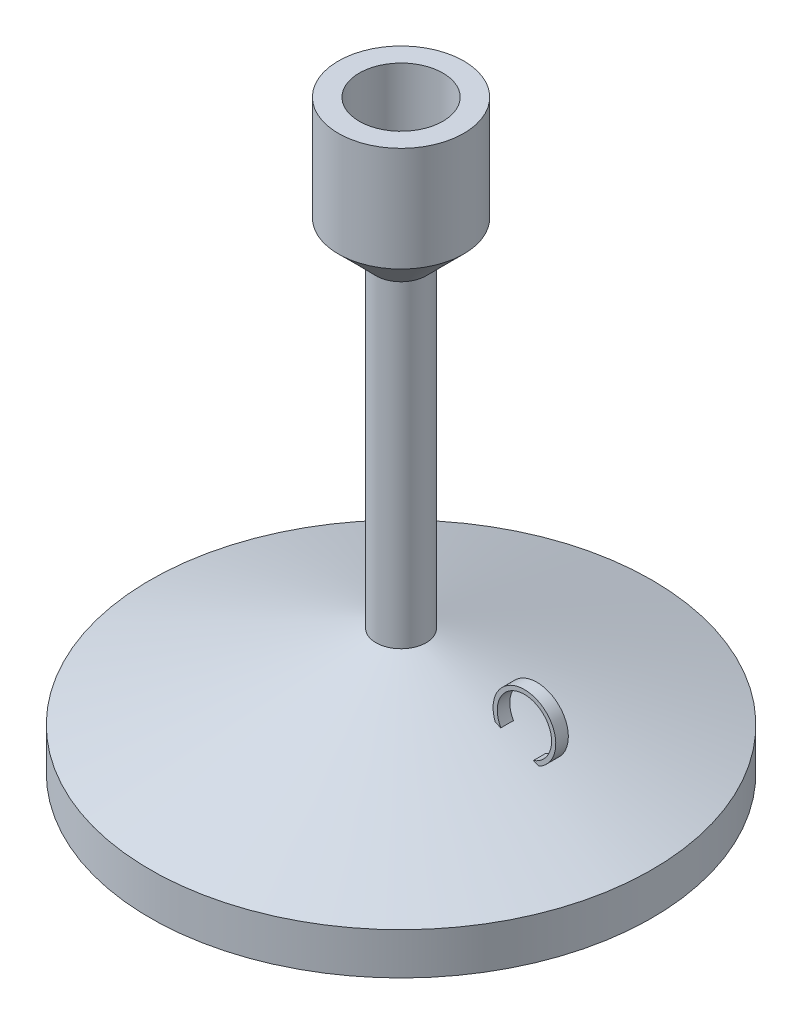
ISO-10303-21;
HEADER;
FILE_DESCRIPTION(('STEP AP214'),'2;1');
FILE_NAME('part.step','',(''),(''),'','','');
FILE_SCHEMA(('AUTOMOTIVE_DESIGN { 1 0 10303 214 1 1 1 1 }'));
ENDSEC;
DATA;
#1=APPLICATION_CONTEXT('core data for automotive mechanical design processes');
#2=APPLICATION_PROTOCOL_DEFINITION('international standard','automotive_design',2000,#1);
#3=PRODUCT_CONTEXT('',#1,'mechanical');
#4=PRODUCT('Part','Part','',(#3));
#5=PRODUCT_RELATED_PRODUCT_CATEGORY('part','',(#4));
#6=PRODUCT_DEFINITION_FORMATION('','',#4);
#7=PRODUCT_DEFINITION_CONTEXT('part definition',#1,'design');
#8=PRODUCT_DEFINITION('design','',#6,#7);
#9=PRODUCT_DEFINITION_SHAPE('','',#8);
#10=(LENGTH_UNIT() NAMED_UNIT(*) SI_UNIT(.MILLI.,.METRE.));
#11=(NAMED_UNIT(*) PLANE_ANGLE_UNIT() SI_UNIT($,.RADIAN.));
#12=(NAMED_UNIT(*) SI_UNIT($,.STERADIAN.) SOLID_ANGLE_UNIT());
#13=UNCERTAINTY_MEASURE_WITH_UNIT(LENGTH_MEASURE(1.E-05),#10,'distance_accuracy_value','');
#14=(GEOMETRIC_REPRESENTATION_CONTEXT(3) GLOBAL_UNCERTAINTY_ASSIGNED_CONTEXT((#13)) GLOBAL_UNIT_ASSIGNED_CONTEXT((#10,
#11,#12)) REPRESENTATION_CONTEXT('',''));
#15=CARTESIAN_POINT('',(0.,0.,0.));
#16=DIRECTION('',(0.,0.,1.));
#17=DIRECTION('',(1.,0.,0.));
#18=AXIS2_PLACEMENT_3D('',#15,#16,#17);
#19=CARTESIAN_POINT('',(0.,30.,0.));
#20=DIRECTION('',(0.,-1.,0.));
#21=DIRECTION('',(0.,0.,-1.));
#22=AXIS2_PLACEMENT_3D('',#19,#20,#21);
#23=CONICAL_SURFACE('',#22,5.99999999999999,1.21609067478396);
#24=CARTESIAN_POINT('',(24.0328279046982,23.2962383808791,-1.8002));
#25=CARTESIAN_POINT('',(24.0251114906346,23.3157206248356,-1.20013333333333));
#26=CARTESIAN_POINT('',(24.0212532836028,23.3254617468138,-0.600066666666667));
#27=CARTESIAN_POINT('',(24.0212532836028,23.3254617468138,0.600066666666666));
#28=CARTESIAN_POINT('',(24.0251114906346,23.3157206248356,1.20013333333333));
#29=CARTESIAN_POINT('',(24.0328279046982,23.2962383808791,1.8002));
#30=B_SPLINE_CURVE_WITH_KNOTS('',3,(#24,#25,#26,#27,#28,#29),.UNSPECIFIED.,.F.,.F.,(4,2,4),(0.,
1.80047438664649,3.60094877329298),.UNSPECIFIED.);
#31=CARTESIAN_POINT('',(24.0292764280352,23.3051671123806,-1.5));
#32=VERTEX_POINT('',#31);
#33=CARTESIAN_POINT('',(24.0292764280352,23.3051671123806,1.5));
#34=VERTEX_POINT('',#33);
#35=EDGE_CURVE('E86',#32,#34,#30,.T.);
#36=ORIENTED_EDGE('',*,*,#35,.F.);
#37=CARTESIAN_POINT('',(57.3571381393473,10.9715745421509,-1.5));
#38=CARTESIAN_POINT('',(55.1617044593834,11.7844167737765,-1.5));
#39=CARTESIAN_POINT('',(52.966262472644,12.5972365742976,-1.5));
#40=CARTESIAN_POINT('',(48.5753491174046,14.2227935255451,-1.5));
#41=CARTESIAN_POINT('',(46.3798777489192,15.0355306763116,-1.5));
#42=CARTESIAN_POINT('',(41.9888935689656,16.6608842790323,-1.5));
#43=CARTESIAN_POINT('',(39.7933807575548,17.4735007311417,-1.5));
#44=CARTESIAN_POINT('',(35.4022831190296,19.0985422471625,-1.5));
#45=CARTESIAN_POINT('',(33.2066982918816,19.9109673109831,-1.5));
#46=CARTESIAN_POINT('',(29.9132224895164,21.1293474796253,-1.5));
#47=CARTESIAN_POINT('',(28.8153793317442,21.535431839088,-1.5));
#48=CARTESIAN_POINT('',(26.6196478662937,22.34747780449,-1.5));
#49=CARTESIAN_POINT('',(25.5217595586242,22.7534394104538,-1.5));
#50=CARTESIAN_POINT('',(23.3259190011344,23.5651846772744,-1.5));
#51=CARTESIAN_POINT('',(22.227966751411,23.9709683383935,-1.5));
#52=CARTESIAN_POINT('',(20.0319603819604,24.7822623390674,-1.5));
#53=CARTESIAN_POINT('',(18.933906262161,25.1877726784268,-1.5));
#54=CARTESIAN_POINT('',(16.7376286578593,25.9983518968117,-1.5));
#55=CARTESIAN_POINT('',(15.6394051725214,26.4034207735737,-1.5));
#56=CARTESIAN_POINT('',(13.9918432352117,27.0104045599791,-1.5));
#57=CARTESIAN_POINT('',(13.4426188235535,27.2126289819693,-1.5));
#58=CARTESIAN_POINT('',(12.3440592751235,27.6167783184049,-1.5));
#59=CARTESIAN_POINT('',(11.794724138262,27.8187032326065,-1.5));
#60=CARTESIAN_POINT('',(10.6958850491634,28.2221076843777,-1.5));
#61=CARTESIAN_POINT('',(10.1463810955352,28.4235872181582,-1.5));
#62=CARTESIAN_POINT('',(9.04711705607618,28.825843222464,-1.5));
#63=CARTESIAN_POINT('',(8.49735697083062,29.0266196945868,-1.5));
#64=CARTESIAN_POINT('',(7.67237817270534,29.3268631335557,-1.5));
#65=CARTESIAN_POINT('',(7.39732736190215,29.4267912529295,-1.5));
#66=CARTESIAN_POINT('',(6.84706941643902,29.6262150827646,-1.5));
#67=CARTESIAN_POINT('',(6.57186228198662,29.7257107937984,-1.5));
#68=CARTESIAN_POINT('',(6.02122957086554,29.9241041333909,-1.5));
#69=CARTESIAN_POINT('',(5.74580399242222,30.0230017570333,-1.5));
#70=CARTESIAN_POINT('',(5.19461553790679,30.2198560202649,-1.5));
#71=CARTESIAN_POINT('',(4.91885266026771,30.3178126554637,-1.5));
#72=CARTESIAN_POINT('',(4.64286186065269,30.4151272941225,-1.5));
#73=B_SPLINE_CURVE_WITH_KNOTS('',3,(#37,#38,#39,#40,#41,#42,#43,#44,#45,#46,#47,#48,#49,#50,#51,
#52,#53,#54,#55,#56,#57,#58,#59,#60,#61,#62,#63,#64,#65,#66,#67,#68,#69,#70,#71,#72),
.UNSPECIFIED.,.F.,.F.,(4,2,2,2,2,2,2,2,2,2,2,2,2,2,2,2,2,4),(0.,7.02323101334685,
14.0464586064617,21.0696770977835,28.0928989144059,31.6045191839793,35.116138752561,
38.6277531260486,42.139370008226,45.6510048120765,47.4068178309309,49.1626322785862,
50.9184616067725,52.6742869425646,53.5522087530624,54.4301294007569,55.3080572553337,
56.185989204066),.UNSPECIFIED.);
#74=CARTESIAN_POINT('',(25.3807528479678,22.8055410602855,-1.5));
#75=VERTEX_POINT('',#74);
#76=EDGE_CURVE('E99',#75,#32,#73,.T.);
#77=ORIENTED_EDGE('',*,*,#76,.F.);
#78=CARTESIAN_POINT('',(25.3861068280374,22.7963498515345,-1.8002));
#79=CARTESIAN_POINT('',(25.3744790112293,22.8163968387028,-1.20013333333333));
#80=CARTESIAN_POINT('',(25.3686651028252,22.826420332287,-0.600066666666667));
#81=CARTESIAN_POINT('',(25.3686651028252,22.826420332287,0.600066666666666));
#82=CARTESIAN_POINT('',(25.3744790112293,22.8163968387028,1.20013333333333));
#83=CARTESIAN_POINT('',(25.3861068280374,22.7963498515345,1.8002));
#84=B_SPLINE_CURVE_WITH_KNOTS('',3,(#78,#79,#80,#81,#82,#83),.UNSPECIFIED.,.F.,.F.,(4,2,4),(0.,
1.80053561130877,3.60107122261755),.UNSPECIFIED.);
#85=CARTESIAN_POINT('',(25.3807528479678,22.8055410602855,1.5));
#86=VERTEX_POINT('',#85);
#87=EDGE_CURVE('E108',#75,#86,#84,.T.);
#88=ORIENTED_EDGE('',*,*,#87,.T.);
#89=CARTESIAN_POINT('',(57.3571381393473,10.9715745421509,1.5));
#90=CARTESIAN_POINT('',(55.1617044593834,11.7844167737765,1.5));
#91=CARTESIAN_POINT('',(52.966262472644,12.5972365742976,1.5));
#92=CARTESIAN_POINT('',(48.5753491174046,14.2227935255451,1.5));
#93=CARTESIAN_POINT('',(46.3798777489192,15.0355306763116,1.5));
#94=CARTESIAN_POINT('',(41.9888935689656,16.6608842790323,1.5));
#95=CARTESIAN_POINT('',(39.7933807575548,17.4735007311417,1.5));
#96=CARTESIAN_POINT('',(35.4022831190296,19.0985422471625,1.5));
#97=CARTESIAN_POINT('',(33.2066982918816,19.9109673109831,1.5));
#98=CARTESIAN_POINT('',(29.9132224895164,21.1293474796253,1.5));
#99=CARTESIAN_POINT('',(28.8153793317442,21.535431839088,1.5));
#100=CARTESIAN_POINT('',(26.6196478662937,22.34747780449,1.5));
#101=CARTESIAN_POINT('',(25.5217595586242,22.7534394104538,1.5));
#102=CARTESIAN_POINT('',(23.3259190011344,23.5651846772744,1.5));
#103=CARTESIAN_POINT('',(22.227966751411,23.9709683383935,1.5));
#104=CARTESIAN_POINT('',(20.0319603819604,24.7822623390674,1.5));
#105=CARTESIAN_POINT('',(18.933906262161,25.1877726784268,1.5));
#106=CARTESIAN_POINT('',(16.7376286578593,25.9983518968117,1.5));
#107=CARTESIAN_POINT('',(15.6394051725214,26.4034207735737,1.5));
#108=CARTESIAN_POINT('',(13.9918432352117,27.0104045599791,1.5));
#109=CARTESIAN_POINT('',(13.4426188235535,27.2126289819693,1.5));
#110=CARTESIAN_POINT('',(12.3440592751235,27.6167783184049,1.5));
#111=CARTESIAN_POINT('',(11.794724138262,27.8187032326065,1.5));
#112=CARTESIAN_POINT('',(10.6958850491634,28.2221076843777,1.5));
#113=CARTESIAN_POINT('',(10.1463810955352,28.4235872181582,1.5));
#114=CARTESIAN_POINT('',(9.04711705607618,28.825843222464,1.5));
#115=CARTESIAN_POINT('',(8.49735697083062,29.0266196945868,1.5));
#116=CARTESIAN_POINT('',(7.67237817270534,29.3268631335557,1.5));
#117=CARTESIAN_POINT('',(7.39732736190215,29.4267912529295,1.5));
#118=CARTESIAN_POINT('',(6.84706941643902,29.6262150827646,1.5));
#119=CARTESIAN_POINT('',(6.57186228198662,29.7257107937984,1.5));
#120=CARTESIAN_POINT('',(6.02122957086554,29.9241041333909,1.5));
#121=CARTESIAN_POINT('',(5.74580399242222,30.0230017570333,1.5));
#122=CARTESIAN_POINT('',(5.19461553790679,30.2198560202649,1.5));
#123=CARTESIAN_POINT('',(4.91885266026771,30.3178126554637,1.5));
#124=CARTESIAN_POINT('',(4.64286186065269,30.4151272941225,1.5));
#125=B_SPLINE_CURVE_WITH_KNOTS('',3,(#89,#90,#91,#92,#93,#94,#95,#96,#97,#98,#99,#100,#101,#102,
#103,#104,#105,#106,#107,#108,#109,#110,#111,#112,#113,#114,#115,#116,#117,#118,#119,#120,#121,
#122,#123,#124),.UNSPECIFIED.,.F.,.F.,(4,2,2,2,2,2,2,2,2,2,2,2,2,2,2,2,2,4),(0.,
7.02323101334685,14.0464586064617,21.0696770977835,28.0928989144059,31.6045191839793,
35.116138752561,38.6277531260486,42.139370008226,45.6510048120765,47.4068178309309,
49.1626322785862,50.9184616067725,52.6742869425646,53.5522087530624,54.4301294007569,
55.3080572553337,56.185989204066),.UNSPECIFIED.);
#126=EDGE_CURVE('E92',#86,#34,#125,.T.);
#127=ORIENTED_EDGE('',*,*,#126,.T.);
#128=EDGE_LOOP('',(#36,#77,#88,#127));
#129=FACE_BOUND('',#128,.T.);
#130=CARTESIAN_POINT('',(0.,10.,0.));
#131=DIRECTION('',(0.,-1.,0.));
#132=DIRECTION('',(0.,0.,-1.));
#133=AXIS2_PLACEMENT_3D('',#130,#131,#132);
#134=CIRCLE('',#133,60.);
#135=CARTESIAN_POINT('',(0.,10.,-60.));
#136=VERTEX_POINT('',#135);
#137=EDGE_CURVE('E164',#136,#136,#134,.T.);
#138=ORIENTED_EDGE('',*,*,#137,.F.);
#139=EDGE_LOOP('',(#138));
#140=FACE_BOUND('',#139,.T.);
#141=CARTESIAN_POINT('',(0.,30.,0.));
#142=DIRECTION('',(0.,-1.,0.));
#143=DIRECTION('',(0.,0.,-1.));
#144=AXIS2_PLACEMENT_3D('',#141,#142,#143);
#145=CIRCLE('',#144,5.99999999999999);
#146=CARTESIAN_POINT('',(0.,30.,-5.99999999999999));
#147=VERTEX_POINT('',#146);
#148=EDGE_CURVE('E167',#147,#147,#145,.T.);
#149=ORIENTED_EDGE('',*,*,#148,.T.);
#150=EDGE_LOOP('',(#149));
#151=FACE_BOUND('',#150,.T.);
#152=CARTESIAN_POINT('',(34.4862209362343,19.4321575204381,1.8002));
#153=CARTESIAN_POINT('',(34.4991424173695,19.4389653073221,1.20013333333333));
#154=CARTESIAN_POINT('',(34.505603157937,19.4423692007641,0.600066666666667));
#155=CARTESIAN_POINT('',(34.505603157937,19.4423692007641,-0.600066666666666));
#156=CARTESIAN_POINT('',(34.4991424173695,19.4389653073221,-1.20013333333333));
#157=CARTESIAN_POINT('',(34.4862209362343,19.4321575204381,-1.8002));
#158=B_SPLINE_CURVE_WITH_KNOTS('',3,(#152,#153,#154,#155,#156,#157),.UNSPECIFIED.,.F.,.F.,(4,2,
4),(0.,1.80033329940131,3.60066659880262),.UNSPECIFIED.);
#159=CARTESIAN_POINT('',(34.4921543470181,19.4352759061418,1.5));
#160=VERTEX_POINT('',#159);
#161=CARTESIAN_POINT('',(34.4921543470181,19.4352759061418,-1.5));
#162=VERTEX_POINT('',#161);
#163=EDGE_CURVE('E11',#160,#162,#158,.T.);
#164=ORIENTED_EDGE('',*,*,#163,.F.);
#165=CARTESIAN_POINT('',(33.1407569880035,19.9353015789492,1.5));
#166=VERTEX_POINT('',#165);
#167=EDGE_CURVE('E51',#160,#166,#125,.T.);
#168=ORIENTED_EDGE('',*,*,#167,.T.);
#169=CARTESIAN_POINT('',(33.1330555635422,19.9326206811646,1.8002));
#170=CARTESIAN_POINT('',(33.1498127465129,19.9384806374257,1.20013333333333));
#171=CARTESIAN_POINT('',(33.1581913379983,19.9414106155562,0.600066666666667));
#172=CARTESIAN_POINT('',(33.1581913379983,19.9414106155562,-0.600066666666667));
#173=CARTESIAN_POINT('',(33.1498127465129,19.9384806374257,-1.20013333333333));
#174=CARTESIAN_POINT('',(33.1330555635422,19.9326206811646,-1.8002));
#175=B_SPLINE_CURVE_WITH_KNOTS('',3,(#169,#170,#171,#172,#173,#174),.UNSPECIFIED.,.F.,.F.,(4,2,
4),(0.,1.8003969312638,3.60079386252761),.UNSPECIFIED.);
#176=CARTESIAN_POINT('',(33.1407569880035,19.9353015789492,-1.5));
#177=VERTEX_POINT('',#176);
#178=EDGE_CURVE('E80',#166,#177,#175,.T.);
#179=ORIENTED_EDGE('',*,*,#178,.T.);
#180=EDGE_CURVE('E85',#162,#177,#73,.T.);
#181=ORIENTED_EDGE('',*,*,#180,.F.);
#182=EDGE_LOOP('',(#164,#168,#179,#181));
#183=FACE_BOUND('',#182,.T.);
#184=ADVANCED_FACE('F37',(#129,#140,#151,#183),#23,.T.);
#185=CARTESIAN_POINT('',(0.,140.,0.));
#186=DIRECTION('',(0.,-1.,0.));
#187=DIRECTION('',(0.,0.,-1.));
#188=AXIS2_PLACEMENT_3D('',#185,#186,#187);
#189=PLANE('',#188);
#190=CARTESIAN_POINT('',(0.,140.,0.));
#191=DIRECTION('',(0.,1.,0.));
#192=DIRECTION('',(0.,0.,1.));
#193=AXIS2_PLACEMENT_3D('',#190,#191,#192);
#194=CIRCLE('',#193,10.);
#195=CARTESIAN_POINT('',(0.,140.,10.));
#196=VERTEX_POINT('',#195);
#197=EDGE_CURVE('E223',#196,#196,#194,.T.);
#198=ORIENTED_EDGE('',*,*,#197,.F.);
#199=EDGE_LOOP('',(#198));
#200=FACE_BOUND('',#199,.T.);
#201=CARTESIAN_POINT('',(0.,140.,0.));
#202=DIRECTION('',(0.,-1.,0.));
#203=DIRECTION('',(0.,0.,-1.));
#204=AXIS2_PLACEMENT_3D('',#201,#202,#203);
#205=CIRCLE('',#204,15.);
#206=CARTESIAN_POINT('',(0.,140.,-15.));
#207=VERTEX_POINT('',#206);
#208=EDGE_CURVE('E113',#207,#207,#205,.T.);
#209=ORIENTED_EDGE('',*,*,#208,.F.);
#210=EDGE_LOOP('',(#209));
#211=FACE_BOUND('',#210,.T.);
#212=ADVANCED_FACE('F39',(#200,#211),#189,.F.);
#213=CARTESIAN_POINT('',(0.,0.,0.));
#214=DIRECTION('',(0.,-1.,0.));
#215=DIRECTION('',(0.,0.,-1.));
#216=AXIS2_PLACEMENT_3D('',#213,#214,#215);
#217=CYLINDRICAL_SURFACE('',#216,15.);
#218=CARTESIAN_POINT('',(0.,115.,0.));
#219=DIRECTION('',(0.,-1.,0.));
#220=DIRECTION('',(0.,0.,-1.));
#221=AXIS2_PLACEMENT_3D('',#218,#219,#220);
#222=CIRCLE('',#221,15.);
#223=CARTESIAN_POINT('',(0.,115.,-15.));
#224=VERTEX_POINT('',#223);
#225=EDGE_CURVE('E172',#224,#224,#222,.T.);
#226=ORIENTED_EDGE('',*,*,#225,.F.);
#227=EDGE_LOOP('',(#226));
#228=FACE_BOUND('',#227,.T.);
#229=ORIENTED_EDGE('',*,*,#208,.T.);
#230=EDGE_LOOP('',(#229));
#231=FACE_BOUND('',#230,.T.);
#232=ADVANCED_FACE('F158',(#228,#231),#217,.T.);
#233=CARTESIAN_POINT('',(0.,115.,0.));
#234=DIRECTION('',(0.,1.,0.));
#235=DIRECTION('',(0.,0.,1.));
#236=AXIS2_PLACEMENT_3D('',#233,#234,#235);
#237=CONICAL_SURFACE('',#236,15.,0.785398163397449);
#238=CARTESIAN_POINT('',(0.,106.,0.));
#239=DIRECTION('',(0.,-1.,0.));
#240=DIRECTION('',(0.,0.,-1.));
#241=AXIS2_PLACEMENT_3D('',#238,#239,#240);
#242=CIRCLE('',#241,6.);
#243=CARTESIAN_POINT('',(0.,106.,-6.));
#244=VERTEX_POINT('',#243);
#245=EDGE_CURVE('E169',#244,#244,#242,.T.);
#246=ORIENTED_EDGE('',*,*,#245,.F.);
#247=EDGE_LOOP('',(#246));
#248=FACE_BOUND('',#247,.T.);
#249=ORIENTED_EDGE('',*,*,#225,.T.);
#250=EDGE_LOOP('',(#249));
#251=FACE_BOUND('',#250,.T.);
#252=ADVANCED_FACE('F184',(#248,#251),#237,.T.);
#253=CARTESIAN_POINT('',(0.,0.,0.));
#254=DIRECTION('',(0.,-1.,0.));
#255=DIRECTION('',(0.,0.,-1.));
#256=AXIS2_PLACEMENT_3D('',#253,#254,#255);
#257=CYLINDRICAL_SURFACE('',#256,5.99999999999999);
#258=ORIENTED_EDGE('',*,*,#148,.F.);
#259=EDGE_LOOP('',(#258));
#260=FACE_BOUND('',#259,.T.);
#261=ORIENTED_EDGE('',*,*,#245,.T.);
#262=EDGE_LOOP('',(#261));
#263=FACE_BOUND('',#262,.T.);
#264=ADVANCED_FACE('F189',(#260,#263),#257,.T.);
#265=CARTESIAN_POINT('',(0.,0.,0.));
#266=DIRECTION('',(0.,-1.,0.));
#267=DIRECTION('',(0.,0.,-1.));
#268=AXIS2_PLACEMENT_3D('',#265,#266,#267);
#269=CYLINDRICAL_SURFACE('',#268,60.);
#270=CARTESIAN_POINT('',(0.,0.,0.));
#271=DIRECTION('',(0.,-1.,0.));
#272=DIRECTION('',(0.,0.,-1.));
#273=AXIS2_PLACEMENT_3D('',#270,#271,#272);
#274=CIRCLE('',#273,60.);
#275=CARTESIAN_POINT('',(0.,0.,-60.));
#276=VERTEX_POINT('',#275);
#277=EDGE_CURVE('E174',#276,#276,#274,.T.);
#278=ORIENTED_EDGE('',*,*,#277,.F.);
#279=EDGE_LOOP('',(#278));
#280=FACE_BOUND('',#279,.T.);
#281=ORIENTED_EDGE('',*,*,#137,.T.);
#282=EDGE_LOOP('',(#281));
#283=FACE_BOUND('',#282,.T.);
#284=ADVANCED_FACE('F194',(#280,#283),#269,.T.);
#285=CARTESIAN_POINT('',(-60.,0.,0.));
#286=DIRECTION('',(0.,1.,0.));
#287=DIRECTION('',(0.,0.,1.));
#288=AXIS2_PLACEMENT_3D('',#285,#286,#287);
#289=PLANE('',#288);
#290=ORIENTED_EDGE('',*,*,#277,.T.);
#291=EDGE_LOOP('',(#290));
#292=FACE_BOUND('',#291,.T.);
#293=ADVANCED_FACE('F198',(#292),#289,.F.);
#294=CARTESIAN_POINT('',(0.,120.,0.));
#295=DIRECTION('',(0.,1.,0.));
#296=DIRECTION('',(0.,0.,1.));
#297=AXIS2_PLACEMENT_3D('',#294,#295,#296);
#298=CYLINDRICAL_SURFACE('',#297,10.);
#299=CARTESIAN_POINT('',(0.,120.,0.));
#300=DIRECTION('',(0.,1.,0.));
#301=DIRECTION('',(0.,0.,1.));
#302=AXIS2_PLACEMENT_3D('',#299,#300,#301);
#303=CIRCLE('',#302,10.);
#304=CARTESIAN_POINT('',(0.,120.,10.));
#305=VERTEX_POINT('',#304);
#306=EDGE_CURVE('E220',#305,#305,#303,.T.);
#307=ORIENTED_EDGE('',*,*,#306,.F.);
#308=EDGE_LOOP('',(#307));
#309=FACE_BOUND('',#308,.T.);
#310=ORIENTED_EDGE('',*,*,#197,.T.);
#311=EDGE_LOOP('',(#310));
#312=FACE_BOUND('',#311,.T.);
#313=ADVANCED_FACE('F206',(#309,#312),#298,.F.);
#314=CARTESIAN_POINT('',(0.,120.,0.));
#315=DIRECTION('',(0.,1.,0.));
#316=DIRECTION('',(0.,0.,1.));
#317=AXIS2_PLACEMENT_3D('',#314,#315,#316);
#318=PLANE('',#317);
#319=ORIENTED_EDGE('',*,*,#306,.T.);
#320=EDGE_LOOP('',(#319));
#321=FACE_BOUND('',#320,.T.);
#322=ADVANCED_FACE('F138',(#321),#318,.T.);
#323=CARTESIAN_POINT('',(31.,26.0726592773659,1.5));
#324=DIRECTION('',(0.,0.,1.));
#325=DIRECTION('',(1.,0.,0.));
#326=AXIS2_PLACEMENT_3D('',#323,#324,#325);
#327=PLANE('',#326);
#328=ORIENTED_EDGE('',*,*,#167,.F.);
#329=CARTESIAN_POINT('',(31.,26.0726592773659,1.5));
#330=DIRECTION('',(0.,0.,1.));
#331=DIRECTION('',(1.,0.,0.));
#332=AXIS2_PLACEMENT_3D('',#329,#330,#331);
#333=CIRCLE('',#332,7.5);
#334=EDGE_CURVE('E224',#160,#34,#333,.T.);
#335=ORIENTED_EDGE('',*,*,#334,.T.);
#336=ORIENTED_EDGE('',*,*,#126,.F.);
#337=CARTESIAN_POINT('',(31.,26.0726592773659,1.5));
#338=DIRECTION('',(0.,0.,1.));
#339=DIRECTION('',(1.,0.,0.));
#340=AXIS2_PLACEMENT_3D('',#337,#338,#339);
#341=CIRCLE('',#340,6.50000000000001);
#342=EDGE_CURVE('E63',#166,#86,#341,.T.);
#343=ORIENTED_EDGE('',*,*,#342,.F.);
#344=EDGE_LOOP('',(#328,#335,#336,#343));
#345=FACE_BOUND('',#344,.T.);
#346=ADVANCED_FACE('F88',(#345),#327,.T.);
#347=CARTESIAN_POINT('',(31.,26.0726592773659,-1.5));
#348=DIRECTION('',(0.,0.,1.));
#349=DIRECTION('',(1.,0.,0.));
#350=AXIS2_PLACEMENT_3D('',#347,#348,#349);
#351=PLANE('',#350);
#352=CARTESIAN_POINT('',(31.,26.0726592773659,-1.5));
#353=DIRECTION('',(0.,0.,1.));
#354=DIRECTION('',(1.,0.,0.));
#355=AXIS2_PLACEMENT_3D('',#352,#353,#354);
#356=CIRCLE('',#355,7.5);
#357=EDGE_CURVE('E94',#162,#32,#356,.T.);
#358=ORIENTED_EDGE('',*,*,#357,.F.);
#359=ORIENTED_EDGE('',*,*,#180,.T.);
#360=CARTESIAN_POINT('',(31.,26.0726592773659,-1.5));
#361=DIRECTION('',(0.,0.,1.));
#362=DIRECTION('',(1.,0.,0.));
#363=AXIS2_PLACEMENT_3D('',#360,#361,#362);
#364=CIRCLE('',#363,6.50000000000001);
#365=EDGE_CURVE('E58',#177,#75,#364,.T.);
#366=ORIENTED_EDGE('',*,*,#365,.T.);
#367=ORIENTED_EDGE('',*,*,#76,.T.);
#368=EDGE_LOOP('',(#358,#359,#366,#367));
#369=FACE_BOUND('',#368,.T.);
#370=ADVANCED_FACE('F129',(#369),#351,.F.);
#371=CARTESIAN_POINT('',(31.,26.0726592773659,1.5));
#372=DIRECTION('',(0.,0.,-1.));
#373=DIRECTION('',(-1.,0.,0.));
#374=AXIS2_PLACEMENT_3D('',#371,#372,#373);
#375=CYLINDRICAL_SURFACE('',#374,7.5);
#376=ORIENTED_EDGE('',*,*,#334,.F.);
#377=ORIENTED_EDGE('',*,*,#163,.T.);
#378=ORIENTED_EDGE('',*,*,#357,.T.);
#379=ORIENTED_EDGE('',*,*,#35,.T.);
#380=EDGE_LOOP('',(#376,#377,#378,#379));
#381=FACE_BOUND('',#380,.T.);
#382=ADVANCED_FACE('F132',(#381),#375,.T.);
#383=CARTESIAN_POINT('',(31.,26.0726592773659,1.5));
#384=DIRECTION('',(0.,0.,-1.));
#385=DIRECTION('',(-1.,0.,0.));
#386=AXIS2_PLACEMENT_3D('',#383,#384,#385);
#387=CYLINDRICAL_SURFACE('',#386,6.50000000000001);
#388=ORIENTED_EDGE('',*,*,#178,.F.);
#389=ORIENTED_EDGE('',*,*,#342,.T.);
#390=ORIENTED_EDGE('',*,*,#87,.F.);
#391=ORIENTED_EDGE('',*,*,#365,.F.);
#392=EDGE_LOOP('',(#388,#389,#390,#391));
#393=FACE_BOUND('',#392,.T.);
#394=ADVANCED_FACE('F81',(#393),#387,.F.);
#395=CLOSED_SHELL('',(#184,#212,#232,#252,#264,#284,#293,#313,#322,#346,#370,#382,#394));
#396=MANIFOLD_SOLID_BREP('B2',#395);
#397=ADVANCED_BREP_SHAPE_REPRESENTATION('',(#18,#396),#14);
#398=SHAPE_DEFINITION_REPRESENTATION(#9,#397);
ENDSEC;
END-ISO-10303-21;
